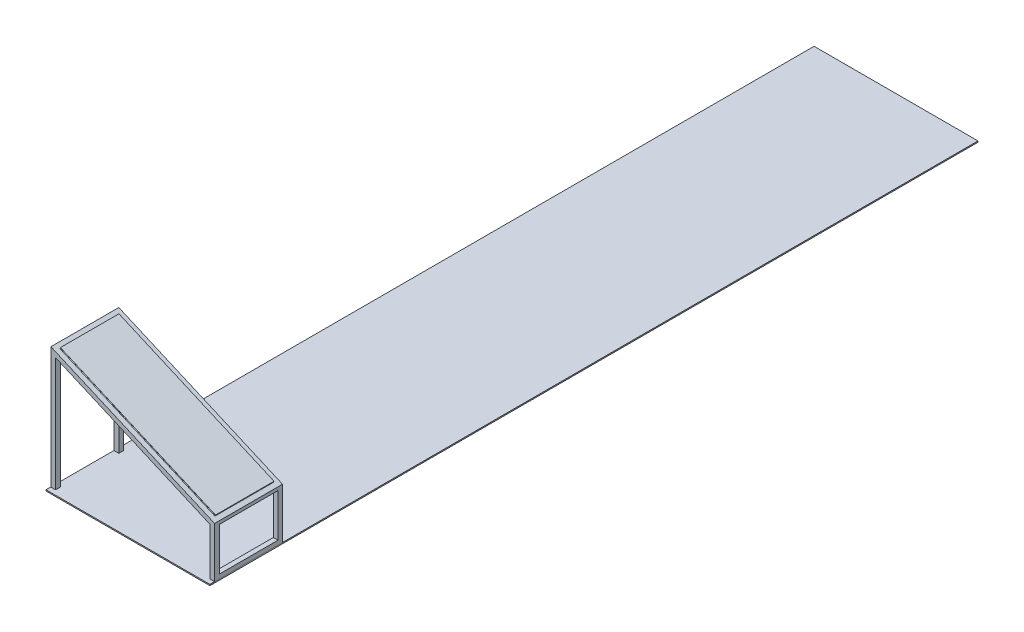
ISO-10303-21;
HEADER;
FILE_DESCRIPTION(('STEP AP214'),'2;1');
FILE_NAME('part.step','',(''),(''),'','','');
FILE_SCHEMA(('AUTOMOTIVE_DESIGN { 1 0 10303 214 1 1 1 1 }'));
ENDSEC;
DATA;
#1=APPLICATION_CONTEXT('core data for automotive mechanical design processes');
#2=APPLICATION_PROTOCOL_DEFINITION('international standard','automotive_design',2000,#1);
#3=PRODUCT_CONTEXT('',#1,'mechanical');
#4=PRODUCT('Part','Part','',(#3));
#5=PRODUCT_RELATED_PRODUCT_CATEGORY('part','',(#4));
#6=PRODUCT_DEFINITION_FORMATION('','',#4);
#7=PRODUCT_DEFINITION_CONTEXT('part definition',#1,'design');
#8=PRODUCT_DEFINITION('design','',#6,#7);
#9=PRODUCT_DEFINITION_SHAPE('','',#8);
#10=(LENGTH_UNIT() NAMED_UNIT(*) SI_UNIT(.MILLI.,.METRE.));
#11=(NAMED_UNIT(*) PLANE_ANGLE_UNIT() SI_UNIT($,.RADIAN.));
#12=(NAMED_UNIT(*) SI_UNIT($,.STERADIAN.) SOLID_ANGLE_UNIT());
#13=UNCERTAINTY_MEASURE_WITH_UNIT(LENGTH_MEASURE(1.E-05),#10,'distance_accuracy_value','');
#14=(GEOMETRIC_REPRESENTATION_CONTEXT(3) GLOBAL_UNCERTAINTY_ASSIGNED_CONTEXT((#13)) GLOBAL_UNIT_ASSIGNED_CONTEXT((#10,
#11,#12)) REPRESENTATION_CONTEXT('',''));
#15=CARTESIAN_POINT('',(0.,0.,0.));
#16=DIRECTION('',(0.,0.,1.));
#17=DIRECTION('',(1.,0.,0.));
#18=AXIS2_PLACEMENT_3D('',#15,#16,#17);
#19=CARTESIAN_POINT('',(42.819236805168,1042.8631524513,-79.9999999999998));
#20=DIRECTION('',(0.917060074385127,-0.39874906892524,0.));
#21=DIRECTION('',(0.39874906892524,0.917060074385127,0.));
#22=AXIS2_PLACEMENT_3D('',#19,#20,#21);
#23=PLANE('',#22);
#24=DIRECTION('',(0.,0.,1.));
#25=VECTOR('',#24,1.);
#26=CARTESIAN_POINT('',(42.4204877362428,1041.94609237692,-79.9999999999998));
#27=LINE('',#26,#25);
#28=CARTESIAN_POINT('',(42.4204877362428,1041.94609237692,-580.));
#29=VERTEX_POINT('',#28);
#30=CARTESIAN_POINT('',(42.4204877362428,1041.94609237692,-79.9999999999998));
#31=VERTEX_POINT('',#30);
#32=EDGE_CURVE('E111',#29,#31,#27,.T.);
#33=ORIENTED_EDGE('',*,*,#32,.T.);
#34=DIRECTION('',(-0.39874906892524,-0.917060074385127,0.));
#35=VECTOR('',#34,1.);
#36=CARTESIAN_POINT('',(42.819236805168,1042.8631524513,-79.9999999999998));
#37=LINE('',#36,#35);
#38=CARTESIAN_POINT('',(42.819236805168,1042.8631524513,-79.9999999999998));
#39=VERTEX_POINT('',#38);
#40=EDGE_CURVE('E12',#39,#31,#37,.T.);
#41=ORIENTED_EDGE('',*,*,#40,.F.);
#42=DIRECTION('',(0.,0.,1.));
#43=VECTOR('',#42,1.);
#44=CARTESIAN_POINT('',(42.819236805168,1042.8631524513,-79.9999999999998));
#45=LINE('',#44,#43);
#46=CARTESIAN_POINT('',(42.819236805168,1042.8631524513,-580.));
#47=VERTEX_POINT('',#46);
#48=EDGE_CURVE('E99',#47,#39,#45,.T.);
#49=ORIENTED_EDGE('',*,*,#48,.F.);
#50=DIRECTION('',(-0.39874906892524,-0.917060074385127,0.));
#51=VECTOR('',#50,1.);
#52=CARTESIAN_POINT('',(42.819236805168,1042.8631524513,-580.));
#53=LINE('',#52,#51);
#54=EDGE_CURVE('E107',#47,#29,#53,.T.);
#55=ORIENTED_EDGE('',*,*,#54,.T.);
#56=EDGE_LOOP('',(#33,#41,#49,#55));
#57=FACE_BOUND('',#56,.T.);
#58=ADVANCED_FACE('F48',(#57),#23,.F.);
#59=CARTESIAN_POINT('',(42.819236805168,1042.8631524513,-79.9999999999998));
#60=DIRECTION('',(0.,0.,-1.));
#61=DIRECTION('',(-1.,0.,0.));
#62=AXIS2_PLACEMENT_3D('',#59,#60,#61);
#63=PLANE('',#62);
#64=DIRECTION('',(0.917060074385127,-0.39874906892524,0.));
#65=VECTOR('',#64,1.);
#66=CARTESIAN_POINT('',(42.4204877362428,1041.94609237692,-79.9999999999998));
#67=LINE('',#66,#65);
#68=CARTESIAN_POINT('',(1367.30508771385,465.869872911501,-79.9999999999998));
#69=VERTEX_POINT('',#68);
#70=EDGE_CURVE('E103',#31,#69,#67,.T.);
#71=ORIENTED_EDGE('',*,*,#70,.T.);
#72=DIRECTION('',(-0.39874906892524,-0.917060074385127,0.));
#73=VECTOR('',#72,1.);
#74=CARTESIAN_POINT('',(1367.70383678277,466.786932985886,-79.9999999999998));
#75=LINE('',#74,#73);
#76=CARTESIAN_POINT('',(1367.70383678277,466.786932985886,-79.9999999999998));
#77=VERTEX_POINT('',#76);
#78=EDGE_CURVE('E56',#77,#69,#75,.T.);
#79=ORIENTED_EDGE('',*,*,#78,.F.);
#80=DIRECTION('',(0.917060074385127,-0.39874906892524,0.));
#81=VECTOR('',#80,1.);
#82=CARTESIAN_POINT('',(42.819236805168,1042.8631524513,-79.9999999999998));
#83=LINE('',#82,#81);
#84=EDGE_CURVE('E94',#39,#77,#83,.T.);
#85=ORIENTED_EDGE('',*,*,#84,.F.);
#86=ORIENTED_EDGE('',*,*,#40,.T.);
#87=EDGE_LOOP('',(#71,#79,#85,#86));
#88=FACE_BOUND('',#87,.T.);
#89=ADVANCED_FACE('F102',(#88),#63,.F.);
#90=CARTESIAN_POINT('',(1367.70383678277,466.786932985886,-79.9999999999998));
#91=DIRECTION('',(-0.917060074385127,0.39874906892524,0.));
#92=DIRECTION('',(-0.39874906892524,-0.917060074385127,0.));
#93=AXIS2_PLACEMENT_3D('',#90,#91,#92);
#94=PLANE('',#93);
#95=DIRECTION('',(0.,0.,-1.));
#96=VECTOR('',#95,1.);
#97=CARTESIAN_POINT('',(1367.30508771385,465.869872911501,-79.9999999999998));
#98=LINE('',#97,#96);
#99=CARTESIAN_POINT('',(1367.30508771385,465.869872911501,-580.));
#100=VERTEX_POINT('',#99);
#101=EDGE_CURVE('E81',#69,#100,#98,.T.);
#102=ORIENTED_EDGE('',*,*,#101,.T.);
#103=DIRECTION('',(-0.39874906892524,-0.917060074385127,0.));
#104=VECTOR('',#103,1.);
#105=CARTESIAN_POINT('',(1367.70383678277,466.786932985886,-580.));
#106=LINE('',#105,#104);
#107=CARTESIAN_POINT('',(1367.70383678277,466.786932985886,-580.));
#108=VERTEX_POINT('',#107);
#109=EDGE_CURVE('E104',#108,#100,#106,.T.);
#110=ORIENTED_EDGE('',*,*,#109,.F.);
#111=DIRECTION('',(0.,0.,-1.));
#112=VECTOR('',#111,1.);
#113=CARTESIAN_POINT('',(1367.70383678277,466.786932985886,-79.9999999999998));
#114=LINE('',#113,#112);
#115=EDGE_CURVE('E97',#77,#108,#114,.T.);
#116=ORIENTED_EDGE('',*,*,#115,.F.);
#117=ORIENTED_EDGE('',*,*,#78,.T.);
#118=EDGE_LOOP('',(#102,#110,#116,#117));
#119=FACE_BOUND('',#118,.T.);
#120=ADVANCED_FACE('F105',(#119),#94,.F.);
#121=CARTESIAN_POINT('',(42.819236805168,1042.8631524513,-580.));
#122=DIRECTION('',(0.,0.,1.));
#123=DIRECTION('',(1.,0.,0.));
#124=AXIS2_PLACEMENT_3D('',#121,#122,#123);
#125=PLANE('',#124);
#126=DIRECTION('',(-0.917060074385127,0.39874906892524,0.));
#127=VECTOR('',#126,1.);
#128=CARTESIAN_POINT('',(42.4204877362428,1041.94609237692,-580.));
#129=LINE('',#128,#127);
#130=EDGE_CURVE('E87',#100,#29,#129,.T.);
#131=ORIENTED_EDGE('',*,*,#130,.T.);
#132=ORIENTED_EDGE('',*,*,#54,.F.);
#133=DIRECTION('',(-0.917060074385127,0.39874906892524,0.));
#134=VECTOR('',#133,1.);
#135=CARTESIAN_POINT('',(42.819236805168,1042.8631524513,-580.));
#136=LINE('',#135,#134);
#137=EDGE_CURVE('E64',#108,#47,#136,.T.);
#138=ORIENTED_EDGE('',*,*,#137,.F.);
#139=ORIENTED_EDGE('',*,*,#109,.T.);
#140=EDGE_LOOP('',(#131,#132,#138,#139));
#141=FACE_BOUND('',#140,.T.);
#142=ADVANCED_FACE('F118',(#141),#125,.F.);
#143=CARTESIAN_POINT('',(388.159207176202,892.705059765339,0.));
#144=DIRECTION('',(-0.39874906892524,-0.917060074385127,0.));
#145=DIRECTION('',(0.917060074385127,-0.39874906892524,0.));
#146=AXIS2_PLACEMENT_3D('',#143,#144,#145);
#147=PLANE('',#146);
#148=ORIENTED_EDGE('',*,*,#48,.T.);
#149=ORIENTED_EDGE('',*,*,#84,.T.);
#150=ORIENTED_EDGE('',*,*,#115,.T.);
#151=ORIENTED_EDGE('',*,*,#137,.T.);
#152=EDGE_LOOP('',(#148,#149,#150,#151));
#153=FACE_BOUND('',#152,.T.);
#154=ADVANCED_FACE('F95',(#153),#147,.F.);
#155=CARTESIAN_POINT('',(387.760458107277,891.787999690954,0.));
#156=DIRECTION('',(-0.39874906892524,-0.917060074385127,0.));
#157=DIRECTION('',(0.917060074385127,-0.39874906892524,0.));
#158=AXIS2_PLACEMENT_3D('',#155,#156,#157);
#159=PLANE('',#158);
#160=ORIENTED_EDGE('',*,*,#32,.F.);
#161=ORIENTED_EDGE('',*,*,#130,.F.);
#162=ORIENTED_EDGE('',*,*,#101,.F.);
#163=ORIENTED_EDGE('',*,*,#70,.F.);
#164=EDGE_LOOP('',(#160,#161,#162,#163));
#165=FACE_BOUND('',#164,.T.);
#166=ADVANCED_FACE('F121',(#165),#159,.T.);
#167=CLOSED_SHELL('',(#58,#89,#120,#142,#154,#166));
#168=MANIFOLD_SOLID_BREP('B2',#167);
#169=CARTESIAN_POINT('',(41.7505940715858,0.,-620.));
#170=DIRECTION('',(-1.,0.,0.));
#171=DIRECTION('',(0.,-1.,0.));
#172=AXIS2_PLACEMENT_3D('',#169,#170,#171);
#173=PLANE('',#172);
#174=DIRECTION('',(0.,0.,1.));
#175=VECTOR('',#174,1.);
#176=CARTESIAN_POINT('',(41.7505940715857,987.715315229322,-620.));
#177=LINE('',#176,#175);
#178=CARTESIAN_POINT('',(41.7505940715857,987.715315229322,-620.));
#179=VERTEX_POINT('',#178);
#180=CARTESIAN_POINT('',(41.7505940715857,987.715315229322,-580.));
#181=VERTEX_POINT('',#180);
#182=EDGE_CURVE('E454',#179,#181,#177,.T.);
#183=ORIENTED_EDGE('',*,*,#182,.T.);
#184=DIRECTION('',(0.,1.,0.));
#185=VECTOR('',#184,1.);
#186=CARTESIAN_POINT('',(41.7505940715858,150.156886009934,-580.));
#187=LINE('',#186,#185);
#188=CARTESIAN_POINT('',(41.7505940715857,10.,-580.));
#189=VERTEX_POINT('',#188);
#190=EDGE_CURVE('E368',#189,#181,#187,.T.);
#191=ORIENTED_EDGE('',*,*,#190,.F.);
#192=DIRECTION('',(0.,0.,1.));
#193=VECTOR('',#192,1.);
#194=CARTESIAN_POINT('',(41.7505940715857,10.,-620.));
#195=LINE('',#194,#193);
#196=CARTESIAN_POINT('',(41.7505940715857,10.,-620.));
#197=VERTEX_POINT('',#196);
#198=EDGE_CURVE('E458',#197,#189,#195,.T.);
#199=ORIENTED_EDGE('',*,*,#198,.F.);
#200=DIRECTION('',(0.,-1.,0.));
#201=VECTOR('',#200,1.);
#202=CARTESIAN_POINT('',(41.7505940715858,0.,-620.));
#203=LINE('',#202,#201);
#204=EDGE_CURVE('E413',#179,#197,#203,.T.);
#205=ORIENTED_EDGE('',*,*,#204,.F.);
#206=EDGE_LOOP('',(#183,#191,#199,#205));
#207=FACE_BOUND('',#206,.T.);
#208=ADVANCED_FACE('F185',(#207),#173,.F.);
#209=CARTESIAN_POINT('',(0.,10.,-620.));
#210=DIRECTION('',(0.,1.,0.));
#211=DIRECTION('',(0.,0.,1.));
#212=AXIS2_PLACEMENT_3D('',#209,#210,#211);
#213=PLANE('',#212);
#214=ORIENTED_EDGE('',*,*,#198,.T.);
#215=DIRECTION('',(1.,0.,0.));
#216=VECTOR('',#215,1.);
#217=CARTESIAN_POINT('',(-345.340495048705,10.,-580.));
#218=LINE('',#217,#216);
#219=CARTESIAN_POINT('',(1.75059407158569,10.,-580.));
#220=VERTEX_POINT('',#219);
#221=EDGE_CURVE('E333',#220,#189,#218,.T.);
#222=ORIENTED_EDGE('',*,*,#221,.F.);
#223=DIRECTION('',(0.,0.,1.));
#224=VECTOR('',#223,1.);
#225=CARTESIAN_POINT('',(1.75059407158569,10.,-620.));
#226=LINE('',#225,#224);
#227=CARTESIAN_POINT('',(1.75059407158569,10.,-620.));
#228=VERTEX_POINT('',#227);
#229=EDGE_CURVE('E329',#228,#220,#226,.T.);
#230=ORIENTED_EDGE('',*,*,#229,.F.);
#231=DIRECTION('',(-1.,0.,0.));
#232=VECTOR('',#231,1.);
#233=CARTESIAN_POINT('',(0.,10.,-620.));
#234=LINE('',#233,#232);
#235=EDGE_CURVE('E411',#197,#228,#234,.T.);
#236=ORIENTED_EDGE('',*,*,#235,.F.);
#237=EDGE_LOOP('',(#214,#222,#230,#236));
#238=FACE_BOUND('',#237,.T.);
#239=ADVANCED_FACE('F502',(#238),#213,.F.);
#240=CARTESIAN_POINT('',(383.772967418025,882.617398947102,-620.));
#241=DIRECTION('',(0.39874906892524,0.917060074385127,0.));
#242=DIRECTION('',(-0.917060074385127,0.39874906892524,0.));
#243=AXIS2_PLACEMENT_3D('',#240,#241,#242);
#244=PLANE('',#243);
#245=DIRECTION('',(0.,0.,1.));
#246=VECTOR('',#245,1.);
#247=CARTESIAN_POINT('',(38.4329970469906,1032.77549163307,-79.9999999999998));
#248=LINE('',#247,#246);
#249=CARTESIAN_POINT('',(38.4329970469906,1032.77549163307,-580.));
#250=VERTEX_POINT('',#249);
#251=CARTESIAN_POINT('',(38.4329970469903,1032.77549163307,-79.9999999999998));
#252=VERTEX_POINT('',#251);
#253=EDGE_CURVE('E376',#250,#252,#248,.T.);
#254=ORIENTED_EDGE('',*,*,#253,.F.);
#255=DIRECTION('',(-0.917060074385127,0.39874906892524,0.));
#256=VECTOR('',#255,1.);
#257=CARTESIAN_POINT('',(38.4329970469906,1032.77549163307,-580.));
#258=LINE('',#257,#256);
#259=CARTESIAN_POINT('',(1363.31759702459,456.699272167649,-580.));
#260=VERTEX_POINT('',#259);
#261=EDGE_CURVE('E385',#260,#250,#258,.T.);
#262=ORIENTED_EDGE('',*,*,#261,.F.);
#263=DIRECTION('',(0.,0.,-1.));
#264=VECTOR('',#263,1.);
#265=CARTESIAN_POINT('',(1363.31759702459,456.699272167649,-580.));
#266=LINE('',#265,#264);
#267=CARTESIAN_POINT('',(1363.31759702459,456.699272167649,-80.));
#268=VERTEX_POINT('',#267);
#269=EDGE_CURVE('E382',#268,#260,#266,.T.);
#270=ORIENTED_EDGE('',*,*,#269,.F.);
#271=DIRECTION('',(0.917060074385127,-0.39874906892524,0.));
#272=VECTOR('',#271,1.);
#273=CARTESIAN_POINT('',(1363.31759702459,456.699272167649,-80.));
#274=LINE('',#273,#272);
#275=EDGE_CURVE('E379',#252,#268,#274,.T.);
#276=ORIENTED_EDGE('',*,*,#275,.F.);
#277=EDGE_LOOP('',(#254,#262,#270,#276));
#278=FACE_BOUND('',#277,.T.);
#279=DIRECTION('',(-0.917060074385127,0.39874906892524,0.));
#280=VECTOR('',#279,1.);
#281=CARTESIAN_POINT('',(383.772967418025,882.617398947102,-40.));
#282=LINE('',#281,#280);
#283=CARTESIAN_POINT('',(1400.,440.74930941064,-40.));
#284=VERTEX_POINT('',#283);
#285=CARTESIAN_POINT('',(1.75059407158562,1048.72545439008,-40.));
#286=VERTEX_POINT('',#285);
#287=EDGE_CURVE('E404',#284,#286,#282,.T.);
#288=ORIENTED_EDGE('',*,*,#287,.F.);
#289=DIRECTION('',(0.,0.,1.));
#290=VECTOR('',#289,1.);
#291=CARTESIAN_POINT('',(1400.,440.74930941064,-620.));
#292=LINE('',#291,#290);
#293=CARTESIAN_POINT('',(1400.,440.74930941064,-620.));
#294=VERTEX_POINT('',#293);
#295=EDGE_CURVE('E443',#294,#284,#292,.T.);
#296=ORIENTED_EDGE('',*,*,#295,.F.);
#297=DIRECTION('',(-0.917060074385127,0.39874906892524,0.));
#298=VECTOR('',#297,1.);
#299=CARTESIAN_POINT('',(383.772967418025,882.617398947102,-620.));
#300=LINE('',#299,#298);
#301=CARTESIAN_POINT('',(1.75059407158562,1048.72545439008,-620.));
#302=VERTEX_POINT('',#301);
#303=EDGE_CURVE('E405',#294,#302,#300,.T.);
#304=ORIENTED_EDGE('',*,*,#303,.T.);
#305=DIRECTION('',(0.,0.,1.));
#306=VECTOR('',#305,1.);
#307=CARTESIAN_POINT('',(1.75059407158562,1048.72545439008,-620.));
#308=LINE('',#307,#306);
#309=EDGE_CURVE('E423',#302,#286,#308,.T.);
#310=ORIENTED_EDGE('',*,*,#309,.T.);
#311=EDGE_LOOP('',(#288,#296,#304,#310));
#312=FACE_BOUND('',#311,.T.);
#313=ADVANCED_FACE('F187',(#278,#312),#244,.T.);
#314=CARTESIAN_POINT('',(1400.,0.,-620.));
#315=DIRECTION('',(-1.,0.,0.));
#316=DIRECTION('',(0.,0.,1.));
#317=AXIS2_PLACEMENT_3D('',#314,#315,#316);
#318=PLANE('',#317);
#319=DIRECTION('',(0.,0.,1.));
#320=VECTOR('',#319,1.);
#321=CARTESIAN_POINT('',(1400.,413.074193211752,0.));
#322=LINE('',#321,#320);
#323=CARTESIAN_POINT('',(1400.,413.074193211752,-581.487315385991));
#324=VERTEX_POINT('',#323);
#325=CARTESIAN_POINT('',(1400.,413.074193211752,-83.8787112059238));
#326=VERTEX_POINT('',#325);
#327=EDGE_CURVE('E351',#324,#326,#322,.T.);
#328=ORIENTED_EDGE('',*,*,#327,.F.);
#329=DIRECTION('',(0.,1.,0.));
#330=VECTOR('',#329,1.);
#331=CARTESIAN_POINT('',(1400.,0.,-581.487315385991));
#332=LINE('',#331,#330);
#333=CARTESIAN_POINT('',(1400.,45.89291548344,-581.487315385991));
#334=VERTEX_POINT('',#333);
#335=EDGE_CURVE('E208',#334,#324,#332,.T.);
#336=ORIENTED_EDGE('',*,*,#335,.F.);
#337=DIRECTION('',(0.,0.,-1.));
#338=VECTOR('',#337,1.);
#339=CARTESIAN_POINT('',(1400.,45.89291548344,0.));
#340=LINE('',#339,#338);
#341=CARTESIAN_POINT('',(1400.,45.89291548344,-83.8787112059238));
#342=VERTEX_POINT('',#341);
#343=EDGE_CURVE('E357',#342,#334,#340,.T.);
#344=ORIENTED_EDGE('',*,*,#343,.F.);
#345=DIRECTION('',(0.,-1.,0.));
#346=VECTOR('',#345,1.);
#347=CARTESIAN_POINT('',(1400.,0.,-83.8787112059238));
#348=LINE('',#347,#346);
#349=EDGE_CURVE('E354',#326,#342,#348,.T.);
#350=ORIENTED_EDGE('',*,*,#349,.F.);
#351=EDGE_LOOP('',(#328,#336,#344,#350));
#352=FACE_BOUND('',#351,.T.);
#353=DIRECTION('',(0.,-1.,0.));
#354=VECTOR('',#353,1.);
#355=CARTESIAN_POINT('',(1400.,0.,-40.));
#356=LINE('',#355,#354);
#357=CARTESIAN_POINT('',(1400.,10.,-40.));
#358=VERTEX_POINT('',#357);
#359=EDGE_CURVE('E409',#284,#358,#356,.T.);
#360=ORIENTED_EDGE('',*,*,#359,.T.);
#361=DIRECTION('',(0.,0.,1.));
#362=VECTOR('',#361,1.);
#363=CARTESIAN_POINT('',(1400.,10.,-620.));
#364=LINE('',#363,#362);
#365=CARTESIAN_POINT('',(1400.,10.,-620.));
#366=VERTEX_POINT('',#365);
#367=EDGE_CURVE('E446',#366,#358,#364,.T.);
#368=ORIENTED_EDGE('',*,*,#367,.F.);
#369=DIRECTION('',(0.,-1.,0.));
#370=VECTOR('',#369,1.);
#371=CARTESIAN_POINT('',(1400.,0.,-620.));
#372=LINE('',#371,#370);
#373=EDGE_CURVE('E421',#294,#366,#372,.T.);
#374=ORIENTED_EDGE('',*,*,#373,.F.);
#375=ORIENTED_EDGE('',*,*,#295,.T.);
#376=EDGE_LOOP('',(#360,#368,#374,#375));
#377=FACE_BOUND('',#376,.T.);
#378=ADVANCED_FACE('F484',(#352,#377),#318,.F.);
#379=DIRECTION('',(-1.,0.,0.));
#380=VECTOR('',#379,1.);
#381=CARTESIAN_POINT('',(0.,10.,-40.));
#382=LINE('',#381,#380);
#383=CARTESIAN_POINT('',(1360.,10.,-40.));
#384=VERTEX_POINT('',#383);
#385=EDGE_CURVE('E433',#358,#384,#382,.T.);
#386=ORIENTED_EDGE('',*,*,#385,.T.);
#387=DIRECTION('',(0.,0.,1.));
#388=VECTOR('',#387,1.);
#389=CARTESIAN_POINT('',(1360.,10.,-620.));
#390=LINE('',#389,#388);
#391=CARTESIAN_POINT('',(1360.,10.,-620.));
#392=VERTEX_POINT('',#391);
#393=EDGE_CURVE('E449',#392,#384,#390,.T.);
#394=ORIENTED_EDGE('',*,*,#393,.F.);
#395=EDGE_CURVE('E414',#366,#392,#234,.T.);
#396=ORIENTED_EDGE('',*,*,#395,.F.);
#397=ORIENTED_EDGE('',*,*,#367,.T.);
#398=EDGE_LOOP('',(#386,#394,#396,#397));
#399=FACE_BOUND('',#398,.T.);
#400=ADVANCED_FACE('F512',(#399),#213,.F.);
#401=CARTESIAN_POINT('',(1360.,0.,-620.));
#402=DIRECTION('',(1.,0.,0.));
#403=DIRECTION('',(0.,0.,-1.));
#404=AXIS2_PLACEMENT_3D('',#401,#402,#403);
#405=PLANE('',#404);
#406=DIRECTION('',(0.,0.,-1.));
#407=VECTOR('',#406,1.);
#408=CARTESIAN_POINT('',(1360.,45.89291548344,-620.));
#409=LINE('',#408,#407);
#410=CARTESIAN_POINT('',(1360.,45.89291548344,-83.8787112059238));
#411=VERTEX_POINT('',#410);
#412=CARTESIAN_POINT('',(1360.,45.89291548344,-581.487315385991));
#413=VERTEX_POINT('',#412);
#414=EDGE_CURVE('E193',#411,#413,#409,.T.);
#415=ORIENTED_EDGE('',*,*,#414,.T.);
#416=DIRECTION('',(0.,1.,0.));
#417=VECTOR('',#416,1.);
#418=CARTESIAN_POINT('',(1360.,0.,-581.487315385991));
#419=LINE('',#418,#417);
#420=CARTESIAN_POINT('',(1360.,413.074193211752,-581.487315385991));
#421=VERTEX_POINT('',#420);
#422=EDGE_CURVE('E46',#413,#421,#419,.T.);
#423=ORIENTED_EDGE('',*,*,#422,.T.);
#424=DIRECTION('',(0.,0.,1.));
#425=VECTOR('',#424,1.);
#426=CARTESIAN_POINT('',(1360.,413.074193211752,-620.));
#427=LINE('',#426,#425);
#428=CARTESIAN_POINT('',(1360.,413.074193211752,-83.8787112059238));
#429=VERTEX_POINT('',#428);
#430=EDGE_CURVE('E445',#421,#429,#427,.T.);
#431=ORIENTED_EDGE('',*,*,#430,.T.);
#432=DIRECTION('',(0.,-1.,0.));
#433=VECTOR('',#432,1.);
#434=CARTESIAN_POINT('',(1360.,0.,-83.8787112059238));
#435=LINE('',#434,#433);
#436=EDGE_CURVE('E467',#429,#411,#435,.T.);
#437=ORIENTED_EDGE('',*,*,#436,.T.);
#438=EDGE_LOOP('',(#415,#423,#431,#437));
#439=FACE_BOUND('',#438,.T.);
#440=DIRECTION('',(0.,1.,0.));
#441=VECTOR('',#440,1.);
#442=CARTESIAN_POINT('',(1360.,0.,-40.));
#443=LINE('',#442,#441);
#444=CARTESIAN_POINT('',(1360.,414.524160246758,-40.));
#445=VERTEX_POINT('',#444);
#446=EDGE_CURVE('E439',#384,#445,#443,.T.);
#447=ORIENTED_EDGE('',*,*,#446,.T.);
#448=DIRECTION('',(0.,0.,1.));
#449=VECTOR('',#448,1.);
#450=CARTESIAN_POINT('',(1360.,414.524160246758,-620.));
#451=LINE('',#450,#449);
#452=CARTESIAN_POINT('',(1360.,414.524160246758,-620.));
#453=VERTEX_POINT('',#452);
#454=EDGE_CURVE('E452',#453,#445,#451,.T.);
#455=ORIENTED_EDGE('',*,*,#454,.F.);
#456=DIRECTION('',(0.,1.,0.));
#457=VECTOR('',#456,1.);
#458=CARTESIAN_POINT('',(1360.,0.,-620.));
#459=LINE('',#458,#457);
#460=EDGE_CURVE('E419',#392,#453,#459,.T.);
#461=ORIENTED_EDGE('',*,*,#460,.F.);
#462=ORIENTED_EDGE('',*,*,#393,.T.);
#463=EDGE_LOOP('',(#447,#455,#461,#462));
#464=FACE_BOUND('',#463,.T.);
#465=ADVANCED_FACE('F471',(#439,#464),#405,.F.);
#466=CARTESIAN_POINT('',(367.823004661016,845.934995971698,-620.));
#467=DIRECTION('',(-0.398749068925241,-0.917060074385126,0.));
#468=DIRECTION('',(0.917060074385126,-0.398749068925241,0.));
#469=AXIS2_PLACEMENT_3D('',#466,#467,#468);
#470=PLANE('',#469);
#471=DIRECTION('',(-0.917060074385126,0.398749068925241,0.));
#472=VECTOR('',#471,1.);
#473=CARTESIAN_POINT('',(22.4830342899814,996.093088657663,-580.));
#474=LINE('',#473,#472);
#475=CARTESIAN_POINT('',(1347.36763426758,420.016869192244,-580.));
#476=VERTEX_POINT('',#475);
#477=EDGE_CURVE('E373',#476,#181,#474,.T.);
#478=ORIENTED_EDGE('',*,*,#477,.T.);
#479=ORIENTED_EDGE('',*,*,#182,.F.);
#480=DIRECTION('',(0.917060074385126,-0.398749068925241,0.));
#481=VECTOR('',#480,1.);
#482=CARTESIAN_POINT('',(367.823004661016,845.934995971698,-620.));
#483=LINE('',#482,#481);
#484=EDGE_CURVE('E416',#179,#453,#483,.T.);
#485=ORIENTED_EDGE('',*,*,#484,.T.);
#486=ORIENTED_EDGE('',*,*,#454,.T.);
#487=DIRECTION('',(0.917060074385126,-0.398749068925241,0.));
#488=VECTOR('',#487,1.);
#489=CARTESIAN_POINT('',(367.823004661016,845.934995971698,-40.));
#490=LINE('',#489,#488);
#491=CARTESIAN_POINT('',(41.7505940715857,987.715315229322,-40.));
#492=VERTEX_POINT('',#491);
#493=EDGE_CURVE('E436',#492,#445,#490,.T.);
#494=ORIENTED_EDGE('',*,*,#493,.F.);
#495=CARTESIAN_POINT('',(41.7505940715857,987.715315229322,-79.9999999999998));
#496=VERTEX_POINT('',#495);
#497=EDGE_CURVE('E457',#496,#492,#177,.T.);
#498=ORIENTED_EDGE('',*,*,#497,.F.);
#499=DIRECTION('',(0.917060074385126,-0.398749068925241,0.));
#500=VECTOR('',#499,1.);
#501=CARTESIAN_POINT('',(1347.36763426759,420.016869192244,-80.));
#502=LINE('',#501,#500);
#503=CARTESIAN_POINT('',(1347.36763426758,420.016869192244,-80.));
#504=VERTEX_POINT('',#503);
#505=EDGE_CURVE('E401',#496,#504,#502,.T.);
#506=ORIENTED_EDGE('',*,*,#505,.T.);
#507=DIRECTION('',(0.,0.,-1.));
#508=VECTOR('',#507,1.);
#509=CARTESIAN_POINT('',(1347.36763426758,420.016869192244,-580.));
#510=LINE('',#509,#508);
#511=EDGE_CURVE('E370',#504,#476,#510,.T.);
#512=ORIENTED_EDGE('',*,*,#511,.T.);
#513=EDGE_LOOP('',(#478,#479,#485,#486,#494,#498,#506,#512));
#514=FACE_BOUND('',#513,.T.);
#515=ADVANCED_FACE('F515',(#514),#470,.T.);
#516=CARTESIAN_POINT('',(41.7505940715857,10.,-79.9999999999998));
#517=VERTEX_POINT('',#516);
#518=CARTESIAN_POINT('',(41.7505940715857,10.,-40.));
#519=VERTEX_POINT('',#518);
#520=EDGE_CURVE('E461',#517,#519,#195,.T.);
#521=ORIENTED_EDGE('',*,*,#520,.F.);
#522=DIRECTION('',(0.,-1.,0.));
#523=VECTOR('',#522,1.);
#524=CARTESIAN_POINT('',(41.7505940715858,-425.919333455484,-79.9999999999999));
#525=LINE('',#524,#523);
#526=EDGE_CURVE('E399',#496,#517,#525,.T.);
#527=ORIENTED_EDGE('',*,*,#526,.F.);
#528=ORIENTED_EDGE('',*,*,#497,.T.);
#529=DIRECTION('',(0.,-1.,0.));
#530=VECTOR('',#529,1.);
#531=CARTESIAN_POINT('',(41.7505940715858,0.,-40.));
#532=LINE('',#531,#530);
#533=EDGE_CURVE('E432',#492,#519,#532,.T.);
#534=ORIENTED_EDGE('',*,*,#533,.T.);
#535=EDGE_LOOP('',(#521,#527,#528,#534));
#536=FACE_BOUND('',#535,.T.);
#537=ADVANCED_FACE('F505',(#536),#173,.F.);
#538=CARTESIAN_POINT('',(1.75059407158569,10.,-79.9999999999998));
#539=VERTEX_POINT('',#538);
#540=CARTESIAN_POINT('',(1.75059407158569,10.,-40.));
#541=VERTEX_POINT('',#540);
#542=EDGE_CURVE('E463',#539,#541,#226,.T.);
#543=ORIENTED_EDGE('',*,*,#542,.F.);
#544=DIRECTION('',(-1.,0.,0.));
#545=VECTOR('',#544,1.);
#546=CARTESIAN_POINT('',(979.544104928899,10.,-80.));
#547=LINE('',#546,#545);
#548=EDGE_CURVE('E396',#517,#539,#547,.T.);
#549=ORIENTED_EDGE('',*,*,#548,.F.);
#550=ORIENTED_EDGE('',*,*,#520,.T.);
#551=EDGE_CURVE('E429',#519,#541,#382,.T.);
#552=ORIENTED_EDGE('',*,*,#551,.T.);
#553=EDGE_LOOP('',(#543,#549,#550,#552));
#554=FACE_BOUND('',#553,.T.);
#555=ADVANCED_FACE('F511',(#554),#213,.F.);
#556=CARTESIAN_POINT('',(1.75059407158576,0.,-620.));
#557=DIRECTION('',(-1.,0.,0.));
#558=DIRECTION('',(0.,-1.,0.));
#559=AXIS2_PLACEMENT_3D('',#556,#557,#558);
#560=PLANE('',#559);
#561=DIRECTION('',(0.,1.,0.));
#562=VECTOR('',#561,1.);
#563=CARTESIAN_POINT('',(1.75059407158579,150.156886009934,-580.));
#564=LINE('',#563,#562);
#565=CARTESIAN_POINT('',(1.75059407158566,1008.72545439008,-580.));
#566=VERTEX_POINT('',#565);
#567=EDGE_CURVE('E323',#220,#566,#564,.T.);
#568=ORIENTED_EDGE('',*,*,#567,.T.);
#569=DIRECTION('',(0.,0.,-1.));
#570=VECTOR('',#569,1.);
#571=CARTESIAN_POINT('',(1.75059407158563,1008.72545439008,-620.));
#572=LINE('',#571,#570);
#573=CARTESIAN_POINT('',(1.75059407158566,1008.72545439008,-80.));
#574=VERTEX_POINT('',#573);
#575=EDGE_CURVE('E326',#574,#566,#572,.T.);
#576=ORIENTED_EDGE('',*,*,#575,.F.);
#577=DIRECTION('',(0.,-1.,0.));
#578=VECTOR('',#577,1.);
#579=CARTESIAN_POINT('',(1.75059407158584,-425.919333455484,-79.9999999999999));
#580=LINE('',#579,#578);
#581=EDGE_CURVE('E389',#574,#539,#580,.T.);
#582=ORIENTED_EDGE('',*,*,#581,.T.);
#583=ORIENTED_EDGE('',*,*,#542,.T.);
#584=DIRECTION('',(0.,-1.,0.));
#585=VECTOR('',#584,1.);
#586=CARTESIAN_POINT('',(1.75059407158576,0.,-40.));
#587=LINE('',#586,#585);
#588=EDGE_CURVE('E426',#286,#541,#587,.T.);
#589=ORIENTED_EDGE('',*,*,#588,.F.);
#590=ORIENTED_EDGE('',*,*,#309,.F.);
#591=DIRECTION('',(0.,-1.,0.));
#592=VECTOR('',#591,1.);
#593=CARTESIAN_POINT('',(1.75059407158576,0.,-620.));
#594=LINE('',#593,#592);
#595=EDGE_CURVE('E408',#302,#228,#594,.T.);
#596=ORIENTED_EDGE('',*,*,#595,.T.);
#597=ORIENTED_EDGE('',*,*,#229,.T.);
#598=EDGE_LOOP('',(#568,#576,#582,#583,#589,#590,#596,#597));
#599=FACE_BOUND('',#598,.T.);
#600=ADVANCED_FACE('F325',(#599),#560,.T.);
#601=CARTESIAN_POINT('',(0.,0.,-620.));
#602=DIRECTION('',(0.,0.,1.));
#603=DIRECTION('',(1.,0.,0.));
#604=AXIS2_PLACEMENT_3D('',#601,#602,#603);
#605=PLANE('',#604);
#606=ORIENTED_EDGE('',*,*,#303,.F.);
#607=ORIENTED_EDGE('',*,*,#373,.T.);
#608=ORIENTED_EDGE('',*,*,#395,.T.);
#609=ORIENTED_EDGE('',*,*,#460,.T.);
#610=ORIENTED_EDGE('',*,*,#484,.F.);
#611=ORIENTED_EDGE('',*,*,#204,.T.);
#612=ORIENTED_EDGE('',*,*,#235,.T.);
#613=ORIENTED_EDGE('',*,*,#595,.F.);
#614=EDGE_LOOP('',(#606,#607,#608,#609,#610,#611,#612,#613));
#615=FACE_BOUND('',#614,.T.);
#616=ADVANCED_FACE('F542',(#615),#605,.F.);
#617=CARTESIAN_POINT('',(0.,0.,-40.));
#618=DIRECTION('',(0.,0.,1.));
#619=DIRECTION('',(1.,0.,0.));
#620=AXIS2_PLACEMENT_3D('',#617,#618,#619);
#621=PLANE('',#620);
#622=ORIENTED_EDGE('',*,*,#287,.T.);
#623=ORIENTED_EDGE('',*,*,#588,.T.);
#624=ORIENTED_EDGE('',*,*,#551,.F.);
#625=ORIENTED_EDGE('',*,*,#533,.F.);
#626=ORIENTED_EDGE('',*,*,#493,.T.);
#627=ORIENTED_EDGE('',*,*,#446,.F.);
#628=ORIENTED_EDGE('',*,*,#385,.F.);
#629=ORIENTED_EDGE('',*,*,#359,.F.);
#630=EDGE_LOOP('',(#622,#623,#624,#625,#626,#627,#628,#629));
#631=FACE_BOUND('',#630,.T.);
#632=ADVANCED_FACE('F533',(#631),#621,.T.);
#633=CARTESIAN_POINT('',(-345.340495048705,150.156886009934,-79.9999999999998));
#634=DIRECTION('',(-0.917060074385127,0.39874906892524,0.));
#635=DIRECTION('',(-0.39874906892524,-0.917060074385127,0.));
#636=AXIS2_PLACEMENT_3D('',#633,#634,#635);
#637=PLANE('',#636);
#638=DIRECTION('',(0.39874906892524,0.917060074385127,0.));
#639=VECTOR('',#638,1.);
#640=CARTESIAN_POINT('',(-345.340495048705,150.156886009934,-79.9999999999998));
#641=LINE('',#640,#639);
#642=CARTESIAN_POINT('',(27.9757432354671,1008.72545439008,-79.9999999999998));
#643=VERTEX_POINT('',#642);
#644=EDGE_CURVE('E387',#643,#252,#641,.T.);
#645=ORIENTED_EDGE('',*,*,#644,.F.);
#646=DIRECTION('',(0.,0.,-1.));
#647=VECTOR('',#646,1.);
#648=CARTESIAN_POINT('',(27.9757432354672,1008.72545439008,-79.9999999999998));
#649=LINE('',#648,#647);
#650=CARTESIAN_POINT('',(27.9757432354671,1008.72545439008,-580.));
#651=VERTEX_POINT('',#650);
#652=EDGE_CURVE('E340',#643,#651,#649,.T.);
#653=ORIENTED_EDGE('',*,*,#652,.T.);
#654=DIRECTION('',(0.39874906892524,0.917060074385127,0.));
#655=VECTOR('',#654,1.);
#656=CARTESIAN_POINT('',(-345.340495048705,150.156886009934,-580.));
#657=LINE('',#656,#655);
#658=EDGE_CURVE('E345',#651,#250,#657,.T.);
#659=ORIENTED_EDGE('',*,*,#658,.T.);
#660=ORIENTED_EDGE('',*,*,#253,.T.);
#661=EDGE_LOOP('',(#645,#653,#659,#660));
#662=FACE_BOUND('',#661,.T.);
#663=ADVANCED_FACE('F565',(#662),#637,.F.);
#664=CARTESIAN_POINT('',(-345.340495048705,150.156886009934,-580.));
#665=DIRECTION('',(0.,0.,-1.));
#666=DIRECTION('',(-1.,0.,0.));
#667=AXIS2_PLACEMENT_3D('',#664,#665,#666);
#668=PLANE('',#667);
#669=ORIENTED_EDGE('',*,*,#658,.F.);
#670=DIRECTION('',(1.,0.,0.));
#671=VECTOR('',#670,1.);
#672=CARTESIAN_POINT('',(-61.2494059284144,1008.72545439008,-580.));
#673=LINE('',#672,#671);
#674=EDGE_CURVE('E338',#566,#651,#673,.T.);
#675=ORIENTED_EDGE('',*,*,#674,.F.);
#676=ORIENTED_EDGE('',*,*,#567,.F.);
#677=ORIENTED_EDGE('',*,*,#221,.T.);
#678=ORIENTED_EDGE('',*,*,#190,.T.);
#679=ORIENTED_EDGE('',*,*,#477,.F.);
#680=DIRECTION('',(0.39874906892524,0.917060074385127,0.));
#681=VECTOR('',#680,1.);
#682=CARTESIAN_POINT('',(979.544104928899,-425.919333455484,-580.));
#683=LINE('',#682,#681);
#684=EDGE_CURVE('E390',#476,#260,#683,.T.);
#685=ORIENTED_EDGE('',*,*,#684,.T.);
#686=ORIENTED_EDGE('',*,*,#261,.T.);
#687=EDGE_LOOP('',(#669,#675,#676,#677,#678,#679,#685,#686));
#688=FACE_BOUND('',#687,.T.);
#689=ADVANCED_FACE('F343',(#688),#668,.F.);
#690=CARTESIAN_POINT('',(979.544104928899,-425.919333455484,-580.));
#691=DIRECTION('',(0.917060074385127,-0.39874906892524,0.));
#692=DIRECTION('',(0.39874906892524,0.917060074385127,0.));
#693=AXIS2_PLACEMENT_3D('',#690,#691,#692);
#694=PLANE('',#693);
#695=DIRECTION('',(0.39874906892524,0.917060074385127,0.));
#696=VECTOR('',#695,1.);
#697=CARTESIAN_POINT('',(979.544104928899,-425.919333455484,-80.));
#698=LINE('',#697,#696);
#699=EDGE_CURVE('E392',#504,#268,#698,.T.);
#700=ORIENTED_EDGE('',*,*,#699,.T.);
#701=ORIENTED_EDGE('',*,*,#269,.T.);
#702=ORIENTED_EDGE('',*,*,#684,.F.);
#703=ORIENTED_EDGE('',*,*,#511,.F.);
#704=EDGE_LOOP('',(#700,#701,#702,#703));
#705=FACE_BOUND('',#704,.T.);
#706=ADVANCED_FACE('F497',(#705),#694,.F.);
#707=CARTESIAN_POINT('',(979.544104928899,-425.919333455484,-80.));
#708=DIRECTION('',(0.,0.,1.));
#709=DIRECTION('',(1.,0.,0.));
#710=AXIS2_PLACEMENT_3D('',#707,#708,#709);
#711=PLANE('',#710);
#712=ORIENTED_EDGE('',*,*,#581,.F.);
#713=DIRECTION('',(1.,0.,0.));
#714=VECTOR('',#713,1.);
#715=CARTESIAN_POINT('',(-61.2494059284144,1008.72545439008,-80.));
#716=LINE('',#715,#714);
#717=EDGE_CURVE('E200',#574,#643,#716,.T.);
#718=ORIENTED_EDGE('',*,*,#717,.T.);
#719=ORIENTED_EDGE('',*,*,#644,.T.);
#720=ORIENTED_EDGE('',*,*,#275,.T.);
#721=ORIENTED_EDGE('',*,*,#699,.F.);
#722=ORIENTED_EDGE('',*,*,#505,.F.);
#723=ORIENTED_EDGE('',*,*,#526,.T.);
#724=ORIENTED_EDGE('',*,*,#548,.T.);
#725=EDGE_LOOP('',(#712,#718,#719,#720,#721,#722,#723,#724));
#726=FACE_BOUND('',#725,.T.);
#727=ADVANCED_FACE('F490',(#726),#711,.F.);
#728=CARTESIAN_POINT('',(1170.,0.,-581.487315385991));
#729=DIRECTION('',(0.,0.,-1.));
#730=DIRECTION('',(-1.,0.,0.));
#731=AXIS2_PLACEMENT_3D('',#728,#729,#730);
#732=PLANE('',#731);
#733=DIRECTION('',(1.,0.,0.));
#734=VECTOR('',#733,1.);
#735=CARTESIAN_POINT('',(1170.,45.89291548344,-581.487315385991));
#736=LINE('',#735,#734);
#737=EDGE_CURVE('E334',#413,#334,#736,.T.);
#738=ORIENTED_EDGE('',*,*,#737,.T.);
#739=ORIENTED_EDGE('',*,*,#335,.T.);
#740=DIRECTION('',(1.,0.,0.));
#741=VECTOR('',#740,1.);
#742=CARTESIAN_POINT('',(1170.,413.074193211752,-581.487315385991));
#743=LINE('',#742,#741);
#744=EDGE_CURVE('E360',#421,#324,#743,.T.);
#745=ORIENTED_EDGE('',*,*,#744,.F.);
#746=ORIENTED_EDGE('',*,*,#422,.F.);
#747=EDGE_LOOP('',(#738,#739,#745,#746));
#748=FACE_BOUND('',#747,.T.);
#749=ADVANCED_FACE('F488',(#748),#732,.F.);
#750=CARTESIAN_POINT('',(1170.,45.89291548344,0.));
#751=DIRECTION('',(0.,-1.,0.));
#752=DIRECTION('',(0.,0.,-1.));
#753=AXIS2_PLACEMENT_3D('',#750,#751,#752);
#754=PLANE('',#753);
#755=DIRECTION('',(1.,0.,0.));
#756=VECTOR('',#755,1.);
#757=CARTESIAN_POINT('',(1170.,45.89291548344,-83.8787112059238));
#758=LINE('',#757,#756);
#759=EDGE_CURVE('E362',#411,#342,#758,.T.);
#760=ORIENTED_EDGE('',*,*,#759,.T.);
#761=ORIENTED_EDGE('',*,*,#343,.T.);
#762=ORIENTED_EDGE('',*,*,#737,.F.);
#763=ORIENTED_EDGE('',*,*,#414,.F.);
#764=EDGE_LOOP('',(#760,#761,#762,#763));
#765=FACE_BOUND('',#764,.T.);
#766=ADVANCED_FACE('F477',(#765),#754,.F.);
#767=CARTESIAN_POINT('',(1170.,0.,-83.8787112059238));
#768=DIRECTION('',(0.,0.,1.));
#769=DIRECTION('',(1.,0.,0.));
#770=AXIS2_PLACEMENT_3D('',#767,#768,#769);
#771=PLANE('',#770);
#772=DIRECTION('',(1.,0.,0.));
#773=VECTOR('',#772,1.);
#774=CARTESIAN_POINT('',(1170.,413.074193211752,-83.8787112059238));
#775=LINE('',#774,#773);
#776=EDGE_CURVE('E364',#429,#326,#775,.T.);
#777=ORIENTED_EDGE('',*,*,#776,.T.);
#778=ORIENTED_EDGE('',*,*,#349,.T.);
#779=ORIENTED_EDGE('',*,*,#759,.F.);
#780=ORIENTED_EDGE('',*,*,#436,.F.);
#781=EDGE_LOOP('',(#777,#778,#779,#780));
#782=FACE_BOUND('',#781,.T.);
#783=ADVANCED_FACE('F479',(#782),#771,.F.);
#784=CARTESIAN_POINT('',(1170.,413.074193211752,0.));
#785=DIRECTION('',(0.,1.,0.));
#786=DIRECTION('',(0.,0.,1.));
#787=AXIS2_PLACEMENT_3D('',#784,#785,#786);
#788=PLANE('',#787);
#789=ORIENTED_EDGE('',*,*,#744,.T.);
#790=ORIENTED_EDGE('',*,*,#327,.T.);
#791=ORIENTED_EDGE('',*,*,#776,.F.);
#792=ORIENTED_EDGE('',*,*,#430,.F.);
#793=EDGE_LOOP('',(#789,#790,#791,#792));
#794=FACE_BOUND('',#793,.T.);
#795=ADVANCED_FACE('F487',(#794),#788,.F.);
#796=CARTESIAN_POINT('',(-61.2494059284144,1008.72545439008,-80.));
#797=DIRECTION('',(0.,1.,0.));
#798=DIRECTION('',(-1.,0.,0.));
#799=AXIS2_PLACEMENT_3D('',#796,#797,#798);
#800=PLANE('',#799);
#801=ORIENTED_EDGE('',*,*,#575,.T.);
#802=ORIENTED_EDGE('',*,*,#674,.T.);
#803=ORIENTED_EDGE('',*,*,#652,.F.);
#804=ORIENTED_EDGE('',*,*,#717,.F.);
#805=EDGE_LOOP('',(#801,#802,#803,#804));
#806=FACE_BOUND('',#805,.T.);
#807=ADVANCED_FACE('F337',(#806),#800,.F.);
#808=CLOSED_SHELL('',(#208,#239,#313,#378,#400,#465,#515,#537,#555,#600,#616,#632,#663,#689,
#706,#727,#749,#766,#783,#795,#807));
#809=MANIFOLD_SOLID_BREP('B6',#808);
#810=CARTESIAN_POINT('',(0.,0.,-6560.));
#811=DIRECTION('',(-1.,0.,0.));
#812=DIRECTION('',(0.,0.,1.));
#813=AXIS2_PLACEMENT_3D('',#810,#811,#812);
#814=PLANE('',#813);
#815=DIRECTION('',(0.,-1.,0.));
#816=VECTOR('',#815,1.);
#817=CARTESIAN_POINT('',(0.,0.,0.));
#818=LINE('',#817,#816);
#819=CARTESIAN_POINT('',(0.,10.,0.));
#820=VERTEX_POINT('',#819);
#821=CARTESIAN_POINT('',(0.,0.,0.));
#822=VERTEX_POINT('',#821);
#823=EDGE_CURVE('E792',#820,#822,#818,.T.);
#824=ORIENTED_EDGE('',*,*,#823,.F.);
#825=DIRECTION('',(0.,0.,1.));
#826=VECTOR('',#825,1.);
#827=CARTESIAN_POINT('',(0.,10.,-6560.));
#828=LINE('',#827,#826);
#829=CARTESIAN_POINT('',(0.,10.,-6560.));
#830=VERTEX_POINT('',#829);
#831=EDGE_CURVE('E183',#830,#820,#828,.T.);
#832=ORIENTED_EDGE('',*,*,#831,.F.);
#833=DIRECTION('',(0.,-1.,0.));
#834=VECTOR('',#833,1.);
#835=CARTESIAN_POINT('',(0.,0.,-6560.));
#836=LINE('',#835,#834);
#837=CARTESIAN_POINT('',(0.,0.,-6560.));
#838=VERTEX_POINT('',#837);
#839=EDGE_CURVE('E786',#830,#838,#836,.T.);
#840=ORIENTED_EDGE('',*,*,#839,.T.);
#841=DIRECTION('',(0.,0.,1.));
#842=VECTOR('',#841,1.);
#843=CARTESIAN_POINT('',(0.,0.,-6560.));
#844=LINE('',#843,#842);
#845=EDGE_CURVE('E731',#838,#822,#844,.T.);
#846=ORIENTED_EDGE('',*,*,#845,.T.);
#847=EDGE_LOOP('',(#824,#832,#840,#846));
#848=FACE_BOUND('',#847,.T.);
#849=ADVANCED_FACE('F728',(#848),#814,.T.);
#850=CARTESIAN_POINT('',(0.,10.,-6560.));
#851=DIRECTION('',(0.,1.,0.));
#852=DIRECTION('',(0.,0.,1.));
#853=AXIS2_PLACEMENT_3D('',#850,#851,#852);
#854=PLANE('',#853);
#855=DIRECTION('',(-1.,0.,0.));
#856=VECTOR('',#855,1.);
#857=CARTESIAN_POINT('',(0.,10.,0.));
#858=LINE('',#857,#856);
#859=CARTESIAN_POINT('',(1400.,10.,0.));
#860=VERTEX_POINT('',#859);
#861=EDGE_CURVE('E788',#860,#820,#858,.T.);
#862=ORIENTED_EDGE('',*,*,#861,.F.);
#863=DIRECTION('',(0.,0.,1.));
#864=VECTOR('',#863,1.);
#865=CARTESIAN_POINT('',(1400.,10.,-6560.));
#866=LINE('',#865,#864);
#867=CARTESIAN_POINT('',(1400.,10.,-6560.));
#868=VERTEX_POINT('',#867);
#869=EDGE_CURVE('E737',#868,#860,#866,.T.);
#870=ORIENTED_EDGE('',*,*,#869,.F.);
#871=DIRECTION('',(-1.,0.,0.));
#872=VECTOR('',#871,1.);
#873=CARTESIAN_POINT('',(0.,10.,-6560.));
#874=LINE('',#873,#872);
#875=EDGE_CURVE('E783',#868,#830,#874,.T.);
#876=ORIENTED_EDGE('',*,*,#875,.T.);
#877=ORIENTED_EDGE('',*,*,#831,.T.);
#878=EDGE_LOOP('',(#862,#870,#876,#877));
#879=FACE_BOUND('',#878,.T.);
#880=ADVANCED_FACE('F802',(#879),#854,.T.);
#881=CARTESIAN_POINT('',(1400.,0.,-6560.));
#882=DIRECTION('',(1.,0.,0.));
#883=DIRECTION('',(0.,0.,-1.));
#884=AXIS2_PLACEMENT_3D('',#881,#882,#883);
#885=PLANE('',#884);
#886=DIRECTION('',(0.,1.,0.));
#887=VECTOR('',#886,1.);
#888=CARTESIAN_POINT('',(1400.,0.,0.));
#889=LINE('',#888,#887);
#890=CARTESIAN_POINT('',(1400.,0.,0.));
#891=VERTEX_POINT('',#890);
#892=EDGE_CURVE('E778',#891,#860,#889,.T.);
#893=ORIENTED_EDGE('',*,*,#892,.F.);
#894=DIRECTION('',(0.,0.,1.));
#895=VECTOR('',#894,1.);
#896=CARTESIAN_POINT('',(1400.,0.,-6560.));
#897=LINE('',#896,#895);
#898=CARTESIAN_POINT('',(1400.,0.,-6560.));
#899=VERTEX_POINT('',#898);
#900=EDGE_CURVE('E773',#899,#891,#897,.T.);
#901=ORIENTED_EDGE('',*,*,#900,.F.);
#902=DIRECTION('',(0.,1.,0.));
#903=VECTOR('',#902,1.);
#904=CARTESIAN_POINT('',(1400.,0.,-6560.));
#905=LINE('',#904,#903);
#906=EDGE_CURVE('E776',#899,#868,#905,.T.);
#907=ORIENTED_EDGE('',*,*,#906,.T.);
#908=ORIENTED_EDGE('',*,*,#869,.T.);
#909=EDGE_LOOP('',(#893,#901,#907,#908));
#910=FACE_BOUND('',#909,.T.);
#911=ADVANCED_FACE('F775',(#910),#885,.T.);
#912=CARTESIAN_POINT('',(0.,0.,-6560.));
#913=DIRECTION('',(0.,-1.,0.));
#914=DIRECTION('',(0.,0.,-1.));
#915=AXIS2_PLACEMENT_3D('',#912,#913,#914);
#916=PLANE('',#915);
#917=DIRECTION('',(1.,0.,0.));
#918=VECTOR('',#917,1.);
#919=CARTESIAN_POINT('',(0.,0.,0.));
#920=LINE('',#919,#918);
#921=EDGE_CURVE('E795',#822,#891,#920,.T.);
#922=ORIENTED_EDGE('',*,*,#921,.F.);
#923=ORIENTED_EDGE('',*,*,#845,.F.);
#924=DIRECTION('',(1.,0.,0.));
#925=VECTOR('',#924,1.);
#926=CARTESIAN_POINT('',(0.,0.,-6560.));
#927=LINE('',#926,#925);
#928=EDGE_CURVE('E782',#838,#899,#927,.T.);
#929=ORIENTED_EDGE('',*,*,#928,.T.);
#930=ORIENTED_EDGE('',*,*,#900,.T.);
#931=EDGE_LOOP('',(#922,#923,#929,#930));
#932=FACE_BOUND('',#931,.T.);
#933=ADVANCED_FACE('F785',(#932),#916,.T.);
#934=CARTESIAN_POINT('',(0.,0.,-6560.));
#935=DIRECTION('',(0.,0.,-1.));
#936=DIRECTION('',(-1.,0.,0.));
#937=AXIS2_PLACEMENT_3D('',#934,#935,#936);
#938=PLANE('',#937);
#939=ORIENTED_EDGE('',*,*,#839,.F.);
#940=ORIENTED_EDGE('',*,*,#875,.F.);
#941=ORIENTED_EDGE('',*,*,#906,.F.);
#942=ORIENTED_EDGE('',*,*,#928,.F.);
#943=EDGE_LOOP('',(#939,#940,#941,#942));
#944=FACE_BOUND('',#943,.T.);
#945=ADVANCED_FACE('F781',(#944),#938,.T.);
#946=CARTESIAN_POINT('',(0.,0.,0.));
#947=DIRECTION('',(0.,0.,-1.));
#948=DIRECTION('',(-1.,0.,0.));
#949=AXIS2_PLACEMENT_3D('',#946,#947,#948);
#950=PLANE('',#949);
#951=ORIENTED_EDGE('',*,*,#823,.T.);
#952=ORIENTED_EDGE('',*,*,#921,.T.);
#953=ORIENTED_EDGE('',*,*,#892,.T.);
#954=ORIENTED_EDGE('',*,*,#861,.T.);
#955=EDGE_LOOP('',(#951,#952,#953,#954));
#956=FACE_BOUND('',#955,.T.);
#957=ADVANCED_FACE('F801',(#956),#950,.F.);
#958=CLOSED_SHELL('',(#849,#880,#911,#933,#945,#957));
#959=MANIFOLD_SOLID_BREP('B40',#958);
#960=ADVANCED_BREP_SHAPE_REPRESENTATION('',(#18,#168,#809,#959),#14);
#961=SHAPE_DEFINITION_REPRESENTATION(#9,#960);
ENDSEC;
END-ISO-10303-21;
